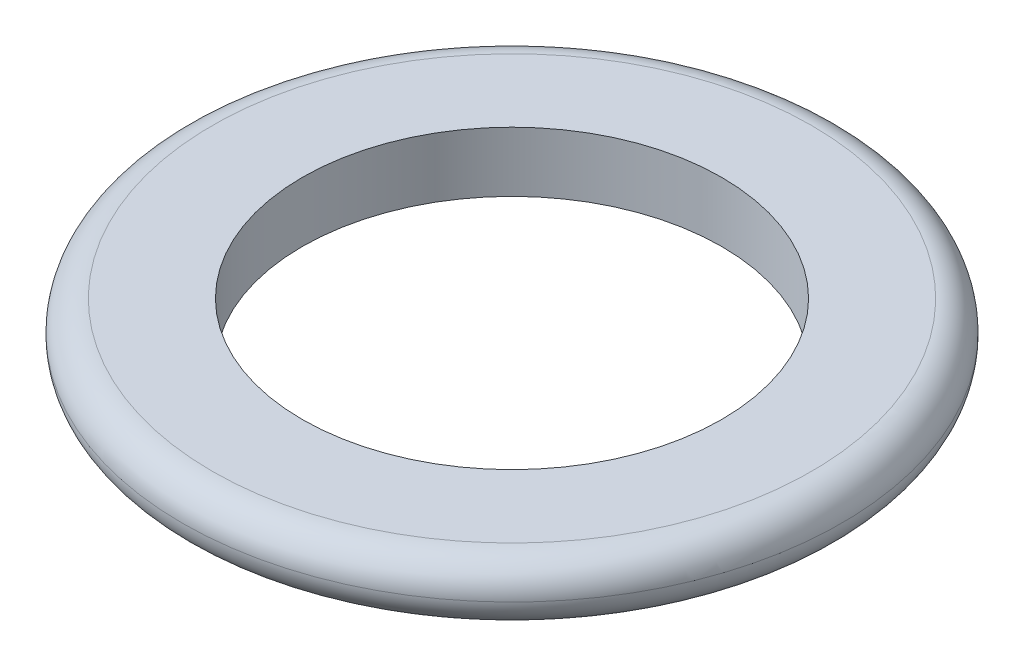
ISO-10303-21;
HEADER;
FILE_DESCRIPTION(('STEP AP214'),'2;1');
FILE_NAME('part.step','',(''),(''),'','','');
FILE_SCHEMA(('AUTOMOTIVE_DESIGN { 1 0 10303 214 1 1 1 1 }'));
ENDSEC;
DATA;
#1=APPLICATION_CONTEXT('core data for automotive mechanical design processes');
#2=APPLICATION_PROTOCOL_DEFINITION('international standard','automotive_design',2000,#1);
#3=PRODUCT_CONTEXT('',#1,'mechanical');
#4=PRODUCT('Part','Part','',(#3));
#5=PRODUCT_RELATED_PRODUCT_CATEGORY('part','',(#4));
#6=PRODUCT_DEFINITION_FORMATION('','',#4);
#7=PRODUCT_DEFINITION_CONTEXT('part definition',#1,'design');
#8=PRODUCT_DEFINITION('design','',#6,#7);
#9=PRODUCT_DEFINITION_SHAPE('','',#8);
#10=(LENGTH_UNIT() NAMED_UNIT(*) SI_UNIT(.MILLI.,.METRE.));
#11=(NAMED_UNIT(*) PLANE_ANGLE_UNIT() SI_UNIT($,.RADIAN.));
#12=(NAMED_UNIT(*) SI_UNIT($,.STERADIAN.) SOLID_ANGLE_UNIT());
#13=UNCERTAINTY_MEASURE_WITH_UNIT(LENGTH_MEASURE(1.E-05),#10,'distance_accuracy_value','');
#14=(GEOMETRIC_REPRESENTATION_CONTEXT(3) GLOBAL_UNCERTAINTY_ASSIGNED_CONTEXT((#13)) GLOBAL_UNIT_ASSIGNED_CONTEXT((#10,
#11,#12)) REPRESENTATION_CONTEXT('',''));
#15=CARTESIAN_POINT('',(0.,0.,0.));
#16=DIRECTION('',(0.,0.,1.));
#17=DIRECTION('',(1.,0.,0.));
#18=AXIS2_PLACEMENT_3D('',#15,#16,#17);
#19=CARTESIAN_POINT('',(0.,0.5,0.));
#20=DIRECTION('',(0.,1.,0.));
#21=DIRECTION('',(0.,0.,1.));
#22=AXIS2_PLACEMENT_3D('',#19,#20,#21);
#23=PLANE('',#22);
#24=CARTESIAN_POINT('',(0.,0.5,0.));
#25=DIRECTION('',(0.,1.,0.));
#26=DIRECTION('',(0.,0.,1.));
#27=AXIS2_PLACEMENT_3D('',#24,#25,#26);
#28=CIRCLE('',#27,5.);
#29=CARTESIAN_POINT('',(0.,0.5,5.));
#30=VERTEX_POINT('',#29);
#31=EDGE_CURVE('E10',#30,#30,#28,.T.);
#32=ORIENTED_EDGE('',*,*,#31,.T.);
#33=EDGE_LOOP('',(#32));
#34=FACE_BOUND('',#33,.T.);
#35=CARTESIAN_POINT('',(0.,0.5,0.));
#36=DIRECTION('',(0.,1.,0.));
#37=DIRECTION('',(0.,0.,1.));
#38=AXIS2_PLACEMENT_3D('',#35,#36,#37);
#39=CIRCLE('',#38,3.5);
#40=CARTESIAN_POINT('',(0.,0.5,3.5));
#41=VERTEX_POINT('',#40);
#42=EDGE_CURVE('E49',#41,#41,#39,.T.);
#43=ORIENTED_EDGE('',*,*,#42,.F.);
#44=EDGE_LOOP('',(#43));
#45=FACE_BOUND('',#44,.T.);
#46=ADVANCED_FACE('F36',(#34,#45),#23,.T.);
#47=CARTESIAN_POINT('',(0.,-0.5,0.));
#48=DIRECTION('',(0.,1.,0.));
#49=DIRECTION('',(0.,0.,1.));
#50=AXIS2_PLACEMENT_3D('',#47,#48,#49);
#51=PLANE('',#50);
#52=CARTESIAN_POINT('',(0.,-0.5,0.));
#53=DIRECTION('',(0.,1.,0.));
#54=DIRECTION('',(0.,0.,1.));
#55=AXIS2_PLACEMENT_3D('',#52,#53,#54);
#56=CIRCLE('',#55,5.);
#57=CARTESIAN_POINT('',(0.,-0.5,5.));
#58=VERTEX_POINT('',#57);
#59=EDGE_CURVE('E46',#58,#58,#56,.F.);
#60=ORIENTED_EDGE('',*,*,#59,.T.);
#61=EDGE_LOOP('',(#60));
#62=FACE_BOUND('',#61,.T.);
#63=CARTESIAN_POINT('',(0.,-0.5,0.));
#64=DIRECTION('',(0.,1.,0.));
#65=DIRECTION('',(0.,0.,1.));
#66=AXIS2_PLACEMENT_3D('',#63,#64,#65);
#67=CIRCLE('',#66,3.5);
#68=CARTESIAN_POINT('',(0.,-0.5,3.5));
#69=VERTEX_POINT('',#68);
#70=EDGE_CURVE('E52',#69,#69,#67,.T.);
#71=ORIENTED_EDGE('',*,*,#70,.T.);
#72=EDGE_LOOP('',(#71));
#73=FACE_BOUND('',#72,.T.);
#74=ADVANCED_FACE('F65',(#62,#73),#51,.F.);
#75=CARTESIAN_POINT('',(0.,0.5,0.));
#76=DIRECTION('',(0.,-1.,0.));
#77=DIRECTION('',(0.,0.,-1.));
#78=AXIS2_PLACEMENT_3D('',#75,#76,#77);
#79=CYLINDRICAL_SURFACE('',#78,3.5);
#80=ORIENTED_EDGE('',*,*,#42,.T.);
#81=EDGE_LOOP('',(#80));
#82=FACE_BOUND('',#81,.T.);
#83=ORIENTED_EDGE('',*,*,#70,.F.);
#84=EDGE_LOOP('',(#83));
#85=FACE_BOUND('',#84,.T.);
#86=ADVANCED_FACE('F56',(#82,#85),#79,.F.);
#87=CARTESIAN_POINT('',(0.,0.,0.));
#88=DIRECTION('',(0.,1.,0.));
#89=DIRECTION('',(0.,0.,1.));
#90=AXIS2_PLACEMENT_3D('',#87,#88,#89);
#91=TOROIDAL_SURFACE('',#90,5.,0.5);
#92=ORIENTED_EDGE('',*,*,#31,.F.);
#93=EDGE_LOOP('',(#92));
#94=FACE_BOUND('',#93,.T.);
#95=CARTESIAN_POINT('',(0.,0.,0.));
#96=DIRECTION('',(0.,1.,0.));
#97=DIRECTION('',(0.,0.,1.));
#98=AXIS2_PLACEMENT_3D('',#95,#96,#97);
#99=CIRCLE('',#98,5.5);
#100=CARTESIAN_POINT('',(0.,0.,5.5));
#101=VERTEX_POINT('',#100);
#102=EDGE_CURVE('E45',#101,#101,#99,.F.);
#103=ORIENTED_EDGE('',*,*,#102,.F.);
#104=EDGE_LOOP('',(#103));
#105=FACE_BOUND('',#104,.T.);
#106=ADVANCED_FACE('F37',(#94,#105),#91,.T.);
#107=CARTESIAN_POINT('',(0.,0.,0.));
#108=DIRECTION('',(0.,1.,0.));
#109=DIRECTION('',(0.,0.,1.));
#110=AXIS2_PLACEMENT_3D('',#107,#108,#109);
#111=TOROIDAL_SURFACE('',#110,5.,0.5);
#112=ORIENTED_EDGE('',*,*,#59,.F.);
#113=EDGE_LOOP('',(#112));
#114=FACE_BOUND('',#113,.T.);
#115=ORIENTED_EDGE('',*,*,#102,.T.);
#116=EDGE_LOOP('',(#115));
#117=FACE_BOUND('',#116,.T.);
#118=ADVANCED_FACE('F72',(#114,#117),#111,.T.);
#119=CLOSED_SHELL('',(#46,#74,#86,#106,#118));
#120=MANIFOLD_SOLID_BREP('B2',#119);
#121=ADVANCED_BREP_SHAPE_REPRESENTATION('',(#18,#120),#14);
#122=SHAPE_DEFINITION_REPRESENTATION(#9,#121);
ENDSEC;
END-ISO-10303-21;
